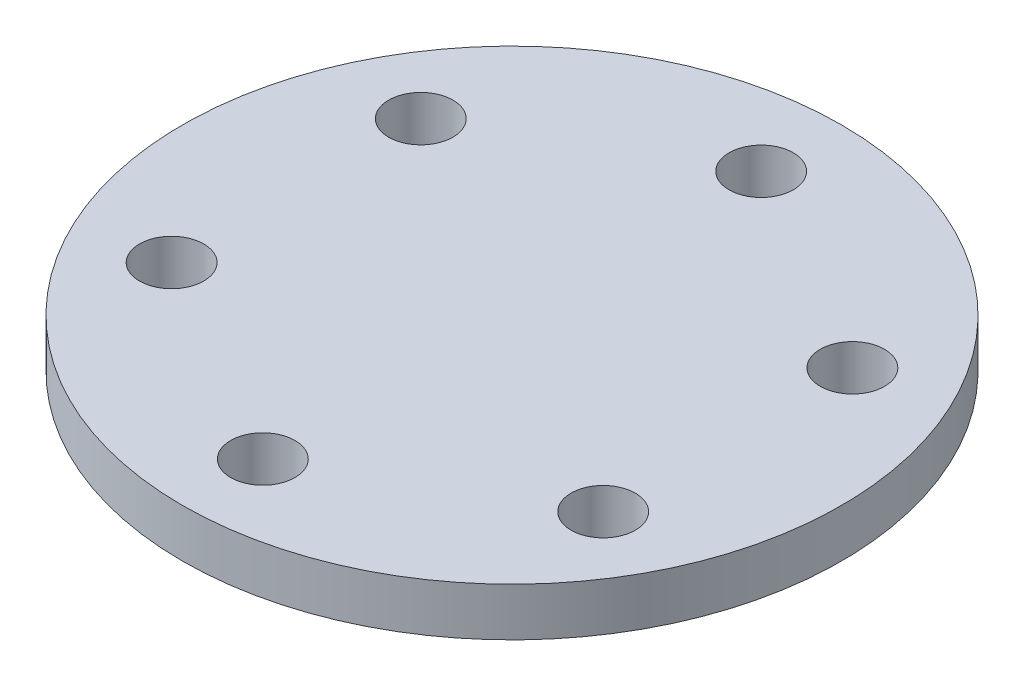
ISO-10303-21;
HEADER;
FILE_DESCRIPTION(('STEP AP214'),'2;1');
FILE_NAME('part.step','',(''),(''),'','','');
FILE_SCHEMA(('AUTOMOTIVE_DESIGN { 1 0 10303 214 1 1 1 1 }'));
ENDSEC;
DATA;
#1=APPLICATION_CONTEXT('core data for automotive mechanical design processes');
#2=APPLICATION_PROTOCOL_DEFINITION('international standard','automotive_design',2000,#1);
#3=PRODUCT_CONTEXT('',#1,'mechanical');
#4=PRODUCT('Part','Part','',(#3));
#5=PRODUCT_RELATED_PRODUCT_CATEGORY('part','',(#4));
#6=PRODUCT_DEFINITION_FORMATION('','',#4);
#7=PRODUCT_DEFINITION_CONTEXT('part definition',#1,'design');
#8=PRODUCT_DEFINITION('design','',#6,#7);
#9=PRODUCT_DEFINITION_SHAPE('','',#8);
#10=(LENGTH_UNIT() NAMED_UNIT(*) SI_UNIT(.MILLI.,.METRE.));
#11=(NAMED_UNIT(*) PLANE_ANGLE_UNIT() SI_UNIT($,.RADIAN.));
#12=(NAMED_UNIT(*) SI_UNIT($,.STERADIAN.) SOLID_ANGLE_UNIT());
#13=UNCERTAINTY_MEASURE_WITH_UNIT(LENGTH_MEASURE(1.E-05),#10,'distance_accuracy_value','');
#14=(GEOMETRIC_REPRESENTATION_CONTEXT(3) GLOBAL_UNCERTAINTY_ASSIGNED_CONTEXT((#13)) GLOBAL_UNIT_ASSIGNED_CONTEXT((#10,
#11,#12)) REPRESENTATION_CONTEXT('',''));
#15=CARTESIAN_POINT('',(0.,0.,0.));
#16=DIRECTION('',(0.,0.,1.));
#17=DIRECTION('',(1.,0.,0.));
#18=AXIS2_PLACEMENT_3D('',#15,#16,#17);
#19=CARTESIAN_POINT('',(0.,3.,0.));
#20=DIRECTION('',(0.,-1.,0.));
#21=DIRECTION('',(0.,0.,-1.));
#22=AXIS2_PLACEMENT_3D('',#19,#20,#21);
#23=CYLINDRICAL_SURFACE('',#22,20.5);
#24=CARTESIAN_POINT('',(0.,3.,0.));
#25=DIRECTION('',(0.,1.,0.));
#26=DIRECTION('',(0.,0.,1.));
#27=AXIS2_PLACEMENT_3D('',#24,#25,#26);
#28=CIRCLE('',#27,20.5);
#29=CARTESIAN_POINT('',(0.,3.,20.5));
#30=VERTEX_POINT('',#29);
#31=EDGE_CURVE('E10',#30,#30,#28,.T.);
#32=ORIENTED_EDGE('',*,*,#31,.F.);
#33=EDGE_LOOP('',(#32));
#34=FACE_BOUND('',#33,.T.);
#35=CARTESIAN_POINT('',(0.,0.,0.));
#36=DIRECTION('',(0.,1.,0.));
#37=DIRECTION('',(0.,0.,1.));
#38=AXIS2_PLACEMENT_3D('',#35,#36,#37);
#39=CIRCLE('',#38,20.5);
#40=CARTESIAN_POINT('',(0.,0.,20.5));
#41=VERTEX_POINT('',#40);
#42=EDGE_CURVE('E37',#41,#41,#39,.T.);
#43=ORIENTED_EDGE('',*,*,#42,.T.);
#44=EDGE_LOOP('',(#43));
#45=FACE_BOUND('',#44,.T.);
#46=ADVANCED_FACE('F34',(#34,#45),#23,.T.);
#47=CARTESIAN_POINT('',(0.,3.,0.));
#48=DIRECTION('',(0.,1.,0.));
#49=DIRECTION('',(0.,0.,1.));
#50=AXIS2_PLACEMENT_3D('',#47,#48,#49);
#51=PLANE('',#50);
#52=CARTESIAN_POINT('',(13.4233937586587,3.,-7.75000000000016));
#53=DIRECTION('',(0.,1.,0.));
#54=DIRECTION('',(-0.866025403784433,0.,0.50000000000001));
#55=AXIS2_PLACEMENT_3D('',#52,#53,#54);
#56=CIRCLE('',#55,2.);
#57=CARTESIAN_POINT('',(13.4233937586587,3.,-5.75000000000016));
#58=VERTEX_POINT('',#57);
#59=EDGE_CURVE('E62',#58,#58,#56,.T.);
#60=ORIENTED_EDGE('',*,*,#59,.F.);
#61=EDGE_LOOP('',(#60));
#62=FACE_BOUND('',#61,.T.);
#63=CARTESIAN_POINT('',(13.4233937586589,3.,7.74999999999987));
#64=DIRECTION('',(0.,1.,0.));
#65=DIRECTION('',(-0.866025403784443,0.,-0.499999999999992));
#66=AXIS2_PLACEMENT_3D('',#63,#64,#65);
#67=CIRCLE('',#66,2.);
#68=CARTESIAN_POINT('',(13.4233937586589,3.,9.74999999999988));
#69=VERTEX_POINT('',#68);
#70=EDGE_CURVE('E61',#69,#69,#67,.T.);
#71=ORIENTED_EDGE('',*,*,#70,.F.);
#72=EDGE_LOOP('',(#71));
#73=FACE_BOUND('',#72,.T.);
#74=CARTESIAN_POINT('',(0.,3.,15.5));
#75=DIRECTION('',(0.,1.,0.));
#76=DIRECTION('',(0.,0.,-1.));
#77=AXIS2_PLACEMENT_3D('',#74,#75,#76);
#78=CIRCLE('',#77,2.);
#79=CARTESIAN_POINT('',(0.,3.,17.5));
#80=VERTEX_POINT('',#79);
#81=EDGE_CURVE('E68',#80,#80,#78,.T.);
#82=ORIENTED_EDGE('',*,*,#81,.F.);
#83=EDGE_LOOP('',(#82));
#84=FACE_BOUND('',#83,.T.);
#85=CARTESIAN_POINT('',(-13.4233937586588,3.,7.75000000000006));
#86=DIRECTION('',(0.,1.,0.));
#87=DIRECTION('',(0.866025403784436,0.,-0.500000000000004));
#88=AXIS2_PLACEMENT_3D('',#85,#86,#87);
#89=CIRCLE('',#88,2.);
#90=CARTESIAN_POINT('',(-13.4233937586588,3.,9.75000000000006));
#91=VERTEX_POINT('',#90);
#92=EDGE_CURVE('E74',#91,#91,#89,.T.);
#93=ORIENTED_EDGE('',*,*,#92,.F.);
#94=EDGE_LOOP('',(#93));
#95=FACE_BOUND('',#94,.T.);
#96=CARTESIAN_POINT('',(-13.4233937586588,3.,-7.74999999999997));
#97=DIRECTION('',(0.,1.,0.));
#98=DIRECTION('',(0.86602540378444,0.,0.499999999999998));
#99=AXIS2_PLACEMENT_3D('',#96,#97,#98);
#100=CIRCLE('',#99,2.);
#101=CARTESIAN_POINT('',(-13.4233937586588,3.,-5.74999999999997));
#102=VERTEX_POINT('',#101);
#103=EDGE_CURVE('E54',#102,#102,#100,.T.);
#104=ORIENTED_EDGE('',*,*,#103,.F.);
#105=EDGE_LOOP('',(#104));
#106=FACE_BOUND('',#105,.T.);
#107=CARTESIAN_POINT('',(0.,3.,-15.5));
#108=DIRECTION('',(0.,1.,0.));
#109=DIRECTION('',(0.,0.,1.));
#110=AXIS2_PLACEMENT_3D('',#107,#108,#109);
#111=CIRCLE('',#110,2.);
#112=CARTESIAN_POINT('',(0.,3.,-13.5));
#113=VERTEX_POINT('',#112);
#114=EDGE_CURVE('E48',#113,#113,#111,.T.);
#115=ORIENTED_EDGE('',*,*,#114,.F.);
#116=EDGE_LOOP('',(#115));
#117=FACE_BOUND('',#116,.T.);
#118=ORIENTED_EDGE('',*,*,#31,.T.);
#119=EDGE_LOOP('',(#118));
#120=FACE_BOUND('',#119,.T.);
#121=ADVANCED_FACE('F85',(#62,#73,#84,#95,#106,#117,#120),#51,.T.);
#122=CARTESIAN_POINT('',(0.,0.,0.));
#123=DIRECTION('',(0.,1.,0.));
#124=DIRECTION('',(0.,0.,1.));
#125=AXIS2_PLACEMENT_3D('',#122,#123,#124);
#126=PLANE('',#125);
#127=CARTESIAN_POINT('',(13.4233937586587,0.,-7.75000000000016));
#128=DIRECTION('',(0.,1.,0.));
#129=DIRECTION('',(0.,0.,1.));
#130=AXIS2_PLACEMENT_3D('',#127,#128,#129);
#131=CIRCLE('',#130,2.);
#132=CARTESIAN_POINT('',(13.4233937586587,0.,-5.75000000000016));
#133=VERTEX_POINT('',#132);
#134=EDGE_CURVE('E58',#133,#133,#131,.F.);
#135=ORIENTED_EDGE('',*,*,#134,.F.);
#136=EDGE_LOOP('',(#135));
#137=FACE_BOUND('',#136,.T.);
#138=CARTESIAN_POINT('',(13.4233937586589,0.,7.74999999999987));
#139=DIRECTION('',(0.,1.,0.));
#140=DIRECTION('',(0.,0.,1.));
#141=AXIS2_PLACEMENT_3D('',#138,#139,#140);
#142=CIRCLE('',#141,2.);
#143=CARTESIAN_POINT('',(13.4233937586589,0.,9.74999999999988));
#144=VERTEX_POINT('',#143);
#145=EDGE_CURVE('E65',#144,#144,#142,.F.);
#146=ORIENTED_EDGE('',*,*,#145,.F.);
#147=EDGE_LOOP('',(#146));
#148=FACE_BOUND('',#147,.T.);
#149=CARTESIAN_POINT('',(0.,0.,15.5));
#150=DIRECTION('',(0.,1.,0.));
#151=DIRECTION('',(0.,0.,1.));
#152=AXIS2_PLACEMENT_3D('',#149,#150,#151);
#153=CIRCLE('',#152,2.);
#154=CARTESIAN_POINT('',(0.,0.,17.5));
#155=VERTEX_POINT('',#154);
#156=EDGE_CURVE('E71',#155,#155,#153,.F.);
#157=ORIENTED_EDGE('',*,*,#156,.F.);
#158=EDGE_LOOP('',(#157));
#159=FACE_BOUND('',#158,.T.);
#160=CARTESIAN_POINT('',(-13.4233937586588,0.,7.75000000000006));
#161=DIRECTION('',(0.,1.,0.));
#162=DIRECTION('',(0.,0.,1.));
#163=AXIS2_PLACEMENT_3D('',#160,#161,#162);
#164=CIRCLE('',#163,2.);
#165=CARTESIAN_POINT('',(-13.4233937586588,0.,9.75000000000006));
#166=VERTEX_POINT('',#165);
#167=EDGE_CURVE('E57',#166,#166,#164,.F.);
#168=ORIENTED_EDGE('',*,*,#167,.F.);
#169=EDGE_LOOP('',(#168));
#170=FACE_BOUND('',#169,.T.);
#171=CARTESIAN_POINT('',(-13.4233937586588,0.,-7.74999999999997));
#172=DIRECTION('',(0.,1.,0.));
#173=DIRECTION('',(0.,0.,1.));
#174=AXIS2_PLACEMENT_3D('',#171,#172,#173);
#175=CIRCLE('',#174,2.);
#176=CARTESIAN_POINT('',(-13.4233937586588,0.,-5.74999999999997));
#177=VERTEX_POINT('',#176);
#178=EDGE_CURVE('E51',#177,#177,#175,.F.);
#179=ORIENTED_EDGE('',*,*,#178,.F.);
#180=EDGE_LOOP('',(#179));
#181=FACE_BOUND('',#180,.T.);
#182=CARTESIAN_POINT('',(0.,0.,-15.5));
#183=DIRECTION('',(0.,1.,0.));
#184=DIRECTION('',(0.,0.,1.));
#185=AXIS2_PLACEMENT_3D('',#182,#183,#184);
#186=CIRCLE('',#185,2.);
#187=CARTESIAN_POINT('',(0.,0.,-13.5));
#188=VERTEX_POINT('',#187);
#189=EDGE_CURVE('E44',#188,#188,#186,.F.);
#190=ORIENTED_EDGE('',*,*,#189,.F.);
#191=EDGE_LOOP('',(#190));
#192=FACE_BOUND('',#191,.T.);
#193=ORIENTED_EDGE('',*,*,#42,.F.);
#194=EDGE_LOOP('',(#193));
#195=FACE_BOUND('',#194,.T.);
#196=ADVANCED_FACE('F88',(#137,#148,#159,#170,#181,#192,#195),#126,.F.);
#197=CARTESIAN_POINT('',(0.,-0.00100000000000013,-15.5));
#198=DIRECTION('',(0.,1.,0.));
#199=DIRECTION('',(0.,0.,1.));
#200=AXIS2_PLACEMENT_3D('',#197,#198,#199);
#201=CYLINDRICAL_SURFACE('',#200,2.);
#202=CARTESIAN_POINT('',(0.,3.,-13.5));
#203=CARTESIAN_POINT('',(0.,2.96875,-13.5));
#204=CARTESIAN_POINT('',(0.,2.9375,-13.5));
#205=CARTESIAN_POINT('',(0.,2.875,-13.5));
#206=CARTESIAN_POINT('',(0.,2.84375,-13.5));
#207=CARTESIAN_POINT('',(0.,2.78125,-13.5));
#208=CARTESIAN_POINT('',(0.,2.75,-13.5));
#209=CARTESIAN_POINT('',(0.,2.6875,-13.5));
#210=CARTESIAN_POINT('',(0.,2.65625,-13.5));
#211=CARTESIAN_POINT('',(0.,2.59375,-13.5));
#212=CARTESIAN_POINT('',(0.,2.5625,-13.5));
#213=CARTESIAN_POINT('',(0.,2.5,-13.5));
#214=CARTESIAN_POINT('',(0.,2.46875,-13.5));
#215=CARTESIAN_POINT('',(0.,2.40625,-13.5));
#216=CARTESIAN_POINT('',(0.,2.375,-13.5));
#217=CARTESIAN_POINT('',(0.,2.3125,-13.5));
#218=CARTESIAN_POINT('',(0.,2.28125,-13.5));
#219=CARTESIAN_POINT('',(0.,2.21875,-13.5));
#220=CARTESIAN_POINT('',(0.,2.1875,-13.5));
#221=CARTESIAN_POINT('',(0.,2.125,-13.5));
#222=CARTESIAN_POINT('',(0.,2.09375,-13.5));
#223=CARTESIAN_POINT('',(0.,2.03125,-13.5));
#224=CARTESIAN_POINT('',(0.,2.,-13.5));
#225=CARTESIAN_POINT('',(0.,1.9375,-13.5));
#226=CARTESIAN_POINT('',(0.,1.90625,-13.5));
#227=CARTESIAN_POINT('',(0.,1.84375,-13.5));
#228=CARTESIAN_POINT('',(0.,1.8125,-13.5));
#229=CARTESIAN_POINT('',(0.,1.75,-13.5));
#230=CARTESIAN_POINT('',(0.,1.71875,-13.5));
#231=CARTESIAN_POINT('',(0.,1.65625,-13.5));
#232=CARTESIAN_POINT('',(0.,1.625,-13.5));
#233=CARTESIAN_POINT('',(0.,1.5625,-13.5));
#234=CARTESIAN_POINT('',(0.,1.53125,-13.5));
#235=CARTESIAN_POINT('',(0.,1.46875,-13.5));
#236=CARTESIAN_POINT('',(0.,1.4375,-13.5));
#237=CARTESIAN_POINT('',(0.,1.375,-13.5));
#238=CARTESIAN_POINT('',(0.,1.34375,-13.5));
#239=CARTESIAN_POINT('',(0.,1.28125,-13.5));
#240=CARTESIAN_POINT('',(0.,1.25,-13.5));
#241=CARTESIAN_POINT('',(0.,1.1875,-13.5));
#242=CARTESIAN_POINT('',(0.,1.15625,-13.5));
#243=CARTESIAN_POINT('',(0.,1.09375,-13.5));
#244=CARTESIAN_POINT('',(0.,1.0625,-13.5));
#245=CARTESIAN_POINT('',(0.,1.,-13.5));
#246=CARTESIAN_POINT('',(0.,0.96875,-13.5));
#247=CARTESIAN_POINT('',(0.,0.90625,-13.5));
#248=CARTESIAN_POINT('',(0.,0.875,-13.5));
#249=CARTESIAN_POINT('',(0.,0.8125,-13.5));
#250=CARTESIAN_POINT('',(0.,0.78125,-13.5));
#251=CARTESIAN_POINT('',(0.,0.71875,-13.5));
#252=CARTESIAN_POINT('',(0.,0.6875,-13.5));
#253=CARTESIAN_POINT('',(0.,0.625,-13.5));
#254=CARTESIAN_POINT('',(0.,0.59375,-13.5));
#255=CARTESIAN_POINT('',(0.,0.53125,-13.5));
#256=CARTESIAN_POINT('',(0.,0.5,-13.5));
#257=CARTESIAN_POINT('',(0.,0.4375,-13.5));
#258=CARTESIAN_POINT('',(0.,0.40625,-13.5));
#259=CARTESIAN_POINT('',(0.,0.34375,-13.5));
#260=CARTESIAN_POINT('',(0.,0.3125,-13.5));
#261=CARTESIAN_POINT('',(0.,0.25,-13.5));
#262=CARTESIAN_POINT('',(0.,0.21875,-13.5));
#263=CARTESIAN_POINT('',(0.,0.15625,-13.5));
#264=CARTESIAN_POINT('',(0.,0.125,-13.5));
#265=CARTESIAN_POINT('',(0.,0.0625000000000001,-13.5));
#266=CARTESIAN_POINT('',(0.,0.0312500000000001,-13.5));
#267=CARTESIAN_POINT('',(0.,0.,-13.5));
#268=B_SPLINE_CURVE_WITH_KNOTS('',3,(#202,#203,#204,#205,#206,#207,#208,#209,#210,#211,#212,
#213,#214,#215,#216,#217,#218,#219,#220,#221,#222,#223,#224,#225,#226,#227,#228,#229,#230,#231,
#232,#233,#234,#235,#236,#237,#238,#239,#240,#241,#242,#243,#244,#245,#246,#247,#248,#249,#250,
#251,#252,#253,#254,#255,#256,#257,#258,#259,#260,#261,#262,#263,#264,#265,#266,#267),
.UNSPECIFIED.,.F.,.F.,(4,2,2,2,2,2,2,2,2,2,2,2,2,2,2,2,2,2,2,2,2,2,2,2,2,2,2,2,2,2,2,2,4),(0.,
0.0937500000000001,0.1875,0.28125,0.375,0.46875,0.5625,0.65625,0.75,0.84375,0.9375,1.03125,
1.125,1.21875,1.3125,1.40625,1.5,1.59375,1.6875,1.78125,1.875,1.96875,2.0625,2.15625,2.25,
2.34375,2.4375,2.53125,2.625,2.71875,2.8125,2.90625,3.),.UNSPECIFIED.);
#269=EDGE_CURVE('BSEAM95',#113,#188,#268,.T.);
#270=ORIENTED_EDGE('',*,*,#114,.T.);
#271=ORIENTED_EDGE('',*,*,#189,.T.);
#272=ORIENTED_EDGE('',*,*,#269,.T.);
#273=ORIENTED_EDGE('',*,*,#269,.F.);
#274=EDGE_LOOP('',(#270,#272,#271,#273));
#275=FACE_BOUND('',#274,.T.);
#276=ADVANCED_FACE('F95',(#275),#201,.F.);
#277=CARTESIAN_POINT('',(-13.4233937586588,-0.00100000000000013,-7.74999999999997));
#278=DIRECTION('',(0.,1.,0.));
#279=DIRECTION('',(0.,0.,1.));
#280=AXIS2_PLACEMENT_3D('',#277,#278,#279);
#281=CYLINDRICAL_SURFACE('',#280,2.);
#282=CARTESIAN_POINT('',(-13.4233937586588,3.,-5.74999999999997));
#283=CARTESIAN_POINT('',(-13.4233937586588,2.96875,-5.74999999999997));
#284=CARTESIAN_POINT('',(-13.4233937586588,2.9375,-5.74999999999997));
#285=CARTESIAN_POINT('',(-13.4233937586588,2.875,-5.74999999999997));
#286=CARTESIAN_POINT('',(-13.4233937586588,2.84375,-5.74999999999997));
#287=CARTESIAN_POINT('',(-13.4233937586588,2.78125,-5.74999999999997));
#288=CARTESIAN_POINT('',(-13.4233937586588,2.75,-5.74999999999997));
#289=CARTESIAN_POINT('',(-13.4233937586588,2.6875,-5.74999999999997));
#290=CARTESIAN_POINT('',(-13.4233937586588,2.65625,-5.74999999999997));
#291=CARTESIAN_POINT('',(-13.4233937586588,2.59375,-5.74999999999997));
#292=CARTESIAN_POINT('',(-13.4233937586588,2.5625,-5.74999999999997));
#293=CARTESIAN_POINT('',(-13.4233937586588,2.5,-5.74999999999997));
#294=CARTESIAN_POINT('',(-13.4233937586588,2.46875,-5.74999999999997));
#295=CARTESIAN_POINT('',(-13.4233937586588,2.40625,-5.74999999999997));
#296=CARTESIAN_POINT('',(-13.4233937586588,2.375,-5.74999999999997));
#297=CARTESIAN_POINT('',(-13.4233937586588,2.3125,-5.74999999999997));
#298=CARTESIAN_POINT('',(-13.4233937586588,2.28125,-5.74999999999997));
#299=CARTESIAN_POINT('',(-13.4233937586588,2.21875,-5.74999999999997));
#300=CARTESIAN_POINT('',(-13.4233937586588,2.1875,-5.74999999999997));
#301=CARTESIAN_POINT('',(-13.4233937586588,2.125,-5.74999999999997));
#302=CARTESIAN_POINT('',(-13.4233937586588,2.09375,-5.74999999999997));
#303=CARTESIAN_POINT('',(-13.4233937586588,2.03125,-5.74999999999997));
#304=CARTESIAN_POINT('',(-13.4233937586588,2.,-5.74999999999997));
#305=CARTESIAN_POINT('',(-13.4233937586588,1.9375,-5.74999999999997));
#306=CARTESIAN_POINT('',(-13.4233937586588,1.90625,-5.74999999999997));
#307=CARTESIAN_POINT('',(-13.4233937586588,1.84375,-5.74999999999997));
#308=CARTESIAN_POINT('',(-13.4233937586588,1.8125,-5.74999999999997));
#309=CARTESIAN_POINT('',(-13.4233937586588,1.75,-5.74999999999997));
#310=CARTESIAN_POINT('',(-13.4233937586588,1.71875,-5.74999999999997));
#311=CARTESIAN_POINT('',(-13.4233937586588,1.65625,-5.74999999999997));
#312=CARTESIAN_POINT('',(-13.4233937586588,1.625,-5.74999999999997));
#313=CARTESIAN_POINT('',(-13.4233937586588,1.5625,-5.74999999999997));
#314=CARTESIAN_POINT('',(-13.4233937586588,1.53125,-5.74999999999997));
#315=CARTESIAN_POINT('',(-13.4233937586588,1.46875,-5.74999999999997));
#316=CARTESIAN_POINT('',(-13.4233937586588,1.4375,-5.74999999999997));
#317=CARTESIAN_POINT('',(-13.4233937586588,1.375,-5.74999999999997));
#318=CARTESIAN_POINT('',(-13.4233937586588,1.34375,-5.74999999999997));
#319=CARTESIAN_POINT('',(-13.4233937586588,1.28125,-5.74999999999997));
#320=CARTESIAN_POINT('',(-13.4233937586588,1.25,-5.74999999999997));
#321=CARTESIAN_POINT('',(-13.4233937586588,1.1875,-5.74999999999997));
#322=CARTESIAN_POINT('',(-13.4233937586588,1.15625,-5.74999999999997));
#323=CARTESIAN_POINT('',(-13.4233937586588,1.09375,-5.74999999999997));
#324=CARTESIAN_POINT('',(-13.4233937586588,1.0625,-5.74999999999997));
#325=CARTESIAN_POINT('',(-13.4233937586588,1.,-5.74999999999997));
#326=CARTESIAN_POINT('',(-13.4233937586588,0.96875,-5.74999999999997));
#327=CARTESIAN_POINT('',(-13.4233937586588,0.90625,-5.74999999999997));
#328=CARTESIAN_POINT('',(-13.4233937586588,0.875,-5.74999999999997));
#329=CARTESIAN_POINT('',(-13.4233937586588,0.8125,-5.74999999999997));
#330=CARTESIAN_POINT('',(-13.4233937586588,0.78125,-5.74999999999997));
#331=CARTESIAN_POINT('',(-13.4233937586588,0.71875,-5.74999999999997));
#332=CARTESIAN_POINT('',(-13.4233937586588,0.6875,-5.74999999999997));
#333=CARTESIAN_POINT('',(-13.4233937586588,0.625,-5.74999999999997));
#334=CARTESIAN_POINT('',(-13.4233937586588,0.59375,-5.74999999999997));
#335=CARTESIAN_POINT('',(-13.4233937586588,0.53125,-5.74999999999997));
#336=CARTESIAN_POINT('',(-13.4233937586588,0.5,-5.74999999999997));
#337=CARTESIAN_POINT('',(-13.4233937586588,0.4375,-5.74999999999997));
#338=CARTESIAN_POINT('',(-13.4233937586588,0.40625,-5.74999999999997));
#339=CARTESIAN_POINT('',(-13.4233937586588,0.34375,-5.74999999999997));
#340=CARTESIAN_POINT('',(-13.4233937586588,0.3125,-5.74999999999997));
#341=CARTESIAN_POINT('',(-13.4233937586588,0.25,-5.74999999999997));
#342=CARTESIAN_POINT('',(-13.4233937586588,0.21875,-5.74999999999997));
#343=CARTESIAN_POINT('',(-13.4233937586588,0.15625,-5.74999999999997));
#344=CARTESIAN_POINT('',(-13.4233937586588,0.125,-5.74999999999997));
#345=CARTESIAN_POINT('',(-13.4233937586588,0.0625000000000001,-5.74999999999997));
#346=CARTESIAN_POINT('',(-13.4233937586588,0.0312500000000001,-5.74999999999997));
#347=CARTESIAN_POINT('',(-13.4233937586588,0.,-5.74999999999997));
#348=B_SPLINE_CURVE_WITH_KNOTS('',3,(#282,#283,#284,#285,#286,#287,#288,#289,#290,#291,#292,
#293,#294,#295,#296,#297,#298,#299,#300,#301,#302,#303,#304,#305,#306,#307,#308,#309,#310,#311,
#312,#313,#314,#315,#316,#317,#318,#319,#320,#321,#322,#323,#324,#325,#326,#327,#328,#329,#330,
#331,#332,#333,#334,#335,#336,#337,#338,#339,#340,#341,#342,#343,#344,#345,#346,#347),
.UNSPECIFIED.,.F.,.F.,(4,2,2,2,2,2,2,2,2,2,2,2,2,2,2,2,2,2,2,2,2,2,2,2,2,2,2,2,2,2,2,2,4),(0.,
0.0937500000000001,0.1875,0.28125,0.375,0.46875,0.5625,0.65625,0.75,0.84375,0.9375,1.03125,
1.125,1.21875,1.3125,1.40625,1.5,1.59375,1.6875,1.78125,1.875,1.96875,2.0625,2.15625,2.25,
2.34375,2.4375,2.53125,2.625,2.71875,2.8125,2.90625,3.),.UNSPECIFIED.);
#349=EDGE_CURVE('BSEAM98',#102,#177,#348,.T.);
#350=ORIENTED_EDGE('',*,*,#103,.T.);
#351=ORIENTED_EDGE('',*,*,#178,.T.);
#352=ORIENTED_EDGE('',*,*,#349,.T.);
#353=ORIENTED_EDGE('',*,*,#349,.F.);
#354=EDGE_LOOP('',(#350,#352,#351,#353));
#355=FACE_BOUND('',#354,.T.);
#356=ADVANCED_FACE('F98',(#355),#281,.F.);
#357=CARTESIAN_POINT('',(-13.4233937586588,-0.00100000000000013,7.75000000000006));
#358=DIRECTION('',(0.,1.,0.));
#359=DIRECTION('',(0.,0.,1.));
#360=AXIS2_PLACEMENT_3D('',#357,#358,#359);
#361=CYLINDRICAL_SURFACE('',#360,2.);
#362=CARTESIAN_POINT('',(-13.4233937586588,3.,9.75000000000006));
#363=CARTESIAN_POINT('',(-13.4233937586588,2.96875,9.75000000000006));
#364=CARTESIAN_POINT('',(-13.4233937586588,2.9375,9.75000000000006));
#365=CARTESIAN_POINT('',(-13.4233937586588,2.875,9.75000000000006));
#366=CARTESIAN_POINT('',(-13.4233937586588,2.84375,9.75000000000006));
#367=CARTESIAN_POINT('',(-13.4233937586588,2.78125,9.75000000000006));
#368=CARTESIAN_POINT('',(-13.4233937586588,2.75,9.75000000000006));
#369=CARTESIAN_POINT('',(-13.4233937586588,2.6875,9.75000000000006));
#370=CARTESIAN_POINT('',(-13.4233937586588,2.65625,9.75000000000006));
#371=CARTESIAN_POINT('',(-13.4233937586588,2.59375,9.75000000000006));
#372=CARTESIAN_POINT('',(-13.4233937586588,2.5625,9.75000000000006));
#373=CARTESIAN_POINT('',(-13.4233937586588,2.5,9.75000000000006));
#374=CARTESIAN_POINT('',(-13.4233937586588,2.46875,9.75000000000006));
#375=CARTESIAN_POINT('',(-13.4233937586588,2.40625,9.75000000000006));
#376=CARTESIAN_POINT('',(-13.4233937586588,2.375,9.75000000000006));
#377=CARTESIAN_POINT('',(-13.4233937586588,2.3125,9.75000000000006));
#378=CARTESIAN_POINT('',(-13.4233937586588,2.28125,9.75000000000006));
#379=CARTESIAN_POINT('',(-13.4233937586588,2.21875,9.75000000000006));
#380=CARTESIAN_POINT('',(-13.4233937586588,2.1875,9.75000000000006));
#381=CARTESIAN_POINT('',(-13.4233937586588,2.125,9.75000000000006));
#382=CARTESIAN_POINT('',(-13.4233937586588,2.09375,9.75000000000006));
#383=CARTESIAN_POINT('',(-13.4233937586588,2.03125,9.75000000000006));
#384=CARTESIAN_POINT('',(-13.4233937586588,2.,9.75000000000006));
#385=CARTESIAN_POINT('',(-13.4233937586588,1.9375,9.75000000000006));
#386=CARTESIAN_POINT('',(-13.4233937586588,1.90625,9.75000000000006));
#387=CARTESIAN_POINT('',(-13.4233937586588,1.84375,9.75000000000006));
#388=CARTESIAN_POINT('',(-13.4233937586588,1.8125,9.75000000000006));
#389=CARTESIAN_POINT('',(-13.4233937586588,1.75,9.75000000000006));
#390=CARTESIAN_POINT('',(-13.4233937586588,1.71875,9.75000000000006));
#391=CARTESIAN_POINT('',(-13.4233937586588,1.65625,9.75000000000006));
#392=CARTESIAN_POINT('',(-13.4233937586588,1.625,9.75000000000006));
#393=CARTESIAN_POINT('',(-13.4233937586588,1.5625,9.75000000000006));
#394=CARTESIAN_POINT('',(-13.4233937586588,1.53125,9.75000000000006));
#395=CARTESIAN_POINT('',(-13.4233937586588,1.46875,9.75000000000006));
#396=CARTESIAN_POINT('',(-13.4233937586588,1.4375,9.75000000000006));
#397=CARTESIAN_POINT('',(-13.4233937586588,1.375,9.75000000000006));
#398=CARTESIAN_POINT('',(-13.4233937586588,1.34375,9.75000000000006));
#399=CARTESIAN_POINT('',(-13.4233937586588,1.28125,9.75000000000006));
#400=CARTESIAN_POINT('',(-13.4233937586588,1.25,9.75000000000006));
#401=CARTESIAN_POINT('',(-13.4233937586588,1.1875,9.75000000000006));
#402=CARTESIAN_POINT('',(-13.4233937586588,1.15625,9.75000000000006));
#403=CARTESIAN_POINT('',(-13.4233937586588,1.09375,9.75000000000006));
#404=CARTESIAN_POINT('',(-13.4233937586588,1.0625,9.75000000000006));
#405=CARTESIAN_POINT('',(-13.4233937586588,1.,9.75000000000006));
#406=CARTESIAN_POINT('',(-13.4233937586588,0.96875,9.75000000000006));
#407=CARTESIAN_POINT('',(-13.4233937586588,0.90625,9.75000000000006));
#408=CARTESIAN_POINT('',(-13.4233937586588,0.875,9.75000000000006));
#409=CARTESIAN_POINT('',(-13.4233937586588,0.8125,9.75000000000006));
#410=CARTESIAN_POINT('',(-13.4233937586588,0.78125,9.75000000000006));
#411=CARTESIAN_POINT('',(-13.4233937586588,0.71875,9.75000000000006));
#412=CARTESIAN_POINT('',(-13.4233937586588,0.6875,9.75000000000006));
#413=CARTESIAN_POINT('',(-13.4233937586588,0.625,9.75000000000006));
#414=CARTESIAN_POINT('',(-13.4233937586588,0.59375,9.75000000000006));
#415=CARTESIAN_POINT('',(-13.4233937586588,0.53125,9.75000000000006));
#416=CARTESIAN_POINT('',(-13.4233937586588,0.5,9.75000000000006));
#417=CARTESIAN_POINT('',(-13.4233937586588,0.4375,9.75000000000006));
#418=CARTESIAN_POINT('',(-13.4233937586588,0.40625,9.75000000000006));
#419=CARTESIAN_POINT('',(-13.4233937586588,0.34375,9.75000000000006));
#420=CARTESIAN_POINT('',(-13.4233937586588,0.3125,9.75000000000006));
#421=CARTESIAN_POINT('',(-13.4233937586588,0.25,9.75000000000006));
#422=CARTESIAN_POINT('',(-13.4233937586588,0.21875,9.75000000000006));
#423=CARTESIAN_POINT('',(-13.4233937586588,0.15625,9.75000000000006));
#424=CARTESIAN_POINT('',(-13.4233937586588,0.125,9.75000000000006));
#425=CARTESIAN_POINT('',(-13.4233937586588,0.0625000000000001,9.75000000000006));
#426=CARTESIAN_POINT('',(-13.4233937586588,0.0312500000000001,9.75000000000006));
#427=CARTESIAN_POINT('',(-13.4233937586588,0.,9.75000000000006));
#428=B_SPLINE_CURVE_WITH_KNOTS('',3,(#362,#363,#364,#365,#366,#367,#368,#369,#370,#371,#372,
#373,#374,#375,#376,#377,#378,#379,#380,#381,#382,#383,#384,#385,#386,#387,#388,#389,#390,#391,
#392,#393,#394,#395,#396,#397,#398,#399,#400,#401,#402,#403,#404,#405,#406,#407,#408,#409,#410,
#411,#412,#413,#414,#415,#416,#417,#418,#419,#420,#421,#422,#423,#424,#425,#426,#427),
.UNSPECIFIED.,.F.,.F.,(4,2,2,2,2,2,2,2,2,2,2,2,2,2,2,2,2,2,2,2,2,2,2,2,2,2,2,2,2,2,2,2,4),(0.,
0.0937500000000001,0.1875,0.28125,0.375,0.46875,0.5625,0.65625,0.75,0.84375,0.9375,1.03125,
1.125,1.21875,1.3125,1.40625,1.5,1.59375,1.6875,1.78125,1.875,1.96875,2.0625,2.15625,2.25,
2.34375,2.4375,2.53125,2.625,2.71875,2.8125,2.90625,3.),.UNSPECIFIED.);
#429=EDGE_CURVE('BSEAM82',#91,#166,#428,.T.);
#430=ORIENTED_EDGE('',*,*,#92,.T.);
#431=ORIENTED_EDGE('',*,*,#167,.T.);
#432=ORIENTED_EDGE('',*,*,#429,.T.);
#433=ORIENTED_EDGE('',*,*,#429,.F.);
#434=EDGE_LOOP('',(#430,#432,#431,#433));
#435=FACE_BOUND('',#434,.T.);
#436=ADVANCED_FACE('F82',(#435),#361,.F.);
#437=CARTESIAN_POINT('',(0.,-0.00100000000000013,15.5));
#438=DIRECTION('',(0.,1.,0.));
#439=DIRECTION('',(0.,0.,1.));
#440=AXIS2_PLACEMENT_3D('',#437,#438,#439);
#441=CYLINDRICAL_SURFACE('',#440,2.);
#442=CARTESIAN_POINT('',(0.,3.,17.5));
#443=CARTESIAN_POINT('',(0.,2.96875,17.5));
#444=CARTESIAN_POINT('',(0.,2.9375,17.5));
#445=CARTESIAN_POINT('',(0.,2.875,17.5));
#446=CARTESIAN_POINT('',(0.,2.84375,17.5));
#447=CARTESIAN_POINT('',(0.,2.78125,17.5));
#448=CARTESIAN_POINT('',(0.,2.75,17.5));
#449=CARTESIAN_POINT('',(0.,2.6875,17.5));
#450=CARTESIAN_POINT('',(0.,2.65625,17.5));
#451=CARTESIAN_POINT('',(0.,2.59375,17.5));
#452=CARTESIAN_POINT('',(0.,2.5625,17.5));
#453=CARTESIAN_POINT('',(0.,2.5,17.5));
#454=CARTESIAN_POINT('',(0.,2.46875,17.5));
#455=CARTESIAN_POINT('',(0.,2.40625,17.5));
#456=CARTESIAN_POINT('',(0.,2.375,17.5));
#457=CARTESIAN_POINT('',(0.,2.3125,17.5));
#458=CARTESIAN_POINT('',(0.,2.28125,17.5));
#459=CARTESIAN_POINT('',(0.,2.21875,17.5));
#460=CARTESIAN_POINT('',(0.,2.1875,17.5));
#461=CARTESIAN_POINT('',(0.,2.125,17.5));
#462=CARTESIAN_POINT('',(0.,2.09375,17.5));
#463=CARTESIAN_POINT('',(0.,2.03125,17.5));
#464=CARTESIAN_POINT('',(0.,2.,17.5));
#465=CARTESIAN_POINT('',(0.,1.9375,17.5));
#466=CARTESIAN_POINT('',(0.,1.90625,17.5));
#467=CARTESIAN_POINT('',(0.,1.84375,17.5));
#468=CARTESIAN_POINT('',(0.,1.8125,17.5));
#469=CARTESIAN_POINT('',(0.,1.75,17.5));
#470=CARTESIAN_POINT('',(0.,1.71875,17.5));
#471=CARTESIAN_POINT('',(0.,1.65625,17.5));
#472=CARTESIAN_POINT('',(0.,1.625,17.5));
#473=CARTESIAN_POINT('',(0.,1.5625,17.5));
#474=CARTESIAN_POINT('',(0.,1.53125,17.5));
#475=CARTESIAN_POINT('',(0.,1.46875,17.5));
#476=CARTESIAN_POINT('',(0.,1.4375,17.5));
#477=CARTESIAN_POINT('',(0.,1.375,17.5));
#478=CARTESIAN_POINT('',(0.,1.34375,17.5));
#479=CARTESIAN_POINT('',(0.,1.28125,17.5));
#480=CARTESIAN_POINT('',(0.,1.25,17.5));
#481=CARTESIAN_POINT('',(0.,1.1875,17.5));
#482=CARTESIAN_POINT('',(0.,1.15625,17.5));
#483=CARTESIAN_POINT('',(0.,1.09375,17.5));
#484=CARTESIAN_POINT('',(0.,1.0625,17.5));
#485=CARTESIAN_POINT('',(0.,1.,17.5));
#486=CARTESIAN_POINT('',(0.,0.96875,17.5));
#487=CARTESIAN_POINT('',(0.,0.90625,17.5));
#488=CARTESIAN_POINT('',(0.,0.875,17.5));
#489=CARTESIAN_POINT('',(0.,0.8125,17.5));
#490=CARTESIAN_POINT('',(0.,0.78125,17.5));
#491=CARTESIAN_POINT('',(0.,0.71875,17.5));
#492=CARTESIAN_POINT('',(0.,0.6875,17.5));
#493=CARTESIAN_POINT('',(0.,0.625,17.5));
#494=CARTESIAN_POINT('',(0.,0.59375,17.5));
#495=CARTESIAN_POINT('',(0.,0.53125,17.5));
#496=CARTESIAN_POINT('',(0.,0.5,17.5));
#497=CARTESIAN_POINT('',(0.,0.4375,17.5));
#498=CARTESIAN_POINT('',(0.,0.40625,17.5));
#499=CARTESIAN_POINT('',(0.,0.34375,17.5));
#500=CARTESIAN_POINT('',(0.,0.3125,17.5));
#501=CARTESIAN_POINT('',(0.,0.25,17.5));
#502=CARTESIAN_POINT('',(0.,0.21875,17.5));
#503=CARTESIAN_POINT('',(0.,0.15625,17.5));
#504=CARTESIAN_POINT('',(0.,0.125,17.5));
#505=CARTESIAN_POINT('',(0.,0.0625000000000001,17.5));
#506=CARTESIAN_POINT('',(0.,0.0312500000000001,17.5));
#507=CARTESIAN_POINT('',(0.,0.,17.5));
#508=B_SPLINE_CURVE_WITH_KNOTS('',3,(#442,#443,#444,#445,#446,#447,#448,#449,#450,#451,#452,
#453,#454,#455,#456,#457,#458,#459,#460,#461,#462,#463,#464,#465,#466,#467,#468,#469,#470,#471,
#472,#473,#474,#475,#476,#477,#478,#479,#480,#481,#482,#483,#484,#485,#486,#487,#488,#489,#490,
#491,#492,#493,#494,#495,#496,#497,#498,#499,#500,#501,#502,#503,#504,#505,#506,#507),
.UNSPECIFIED.,.F.,.F.,(4,2,2,2,2,2,2,2,2,2,2,2,2,2,2,2,2,2,2,2,2,2,2,2,2,2,2,2,2,2,2,2,4),(0.,
0.0937500000000001,0.1875,0.28125,0.375,0.46875,0.5625,0.65625,0.75,0.84375,0.9375,1.03125,
1.125,1.21875,1.3125,1.40625,1.5,1.59375,1.6875,1.78125,1.875,1.96875,2.0625,2.15625,2.25,
2.34375,2.4375,2.53125,2.625,2.71875,2.8125,2.90625,3.),.UNSPECIFIED.);
#509=EDGE_CURVE('BSEAM136',#80,#155,#508,.T.);
#510=ORIENTED_EDGE('',*,*,#81,.T.);
#511=ORIENTED_EDGE('',*,*,#156,.T.);
#512=ORIENTED_EDGE('',*,*,#509,.T.);
#513=ORIENTED_EDGE('',*,*,#509,.F.);
#514=EDGE_LOOP('',(#510,#512,#511,#513));
#515=FACE_BOUND('',#514,.T.);
#516=ADVANCED_FACE('F136',(#515),#441,.F.);
#517=CARTESIAN_POINT('',(13.4233937586589,-0.00100000000000013,7.74999999999987));
#518=DIRECTION('',(0.,1.,0.));
#519=DIRECTION('',(0.,0.,1.));
#520=AXIS2_PLACEMENT_3D('',#517,#518,#519);
#521=CYLINDRICAL_SURFACE('',#520,2.);
#522=CARTESIAN_POINT('',(13.4233937586589,3.,9.74999999999988));
#523=CARTESIAN_POINT('',(13.4233937586589,2.96875,9.74999999999988));
#524=CARTESIAN_POINT('',(13.4233937586589,2.9375,9.74999999999988));
#525=CARTESIAN_POINT('',(13.4233937586589,2.875,9.74999999999988));
#526=CARTESIAN_POINT('',(13.4233937586589,2.84375,9.74999999999988));
#527=CARTESIAN_POINT('',(13.4233937586589,2.78125,9.74999999999988));
#528=CARTESIAN_POINT('',(13.4233937586589,2.75,9.74999999999988));
#529=CARTESIAN_POINT('',(13.4233937586589,2.6875,9.74999999999988));
#530=CARTESIAN_POINT('',(13.4233937586589,2.65625,9.74999999999988));
#531=CARTESIAN_POINT('',(13.4233937586589,2.59375,9.74999999999988));
#532=CARTESIAN_POINT('',(13.4233937586589,2.5625,9.74999999999988));
#533=CARTESIAN_POINT('',(13.4233937586589,2.5,9.74999999999988));
#534=CARTESIAN_POINT('',(13.4233937586589,2.46875,9.74999999999988));
#535=CARTESIAN_POINT('',(13.4233937586589,2.40625,9.74999999999988));
#536=CARTESIAN_POINT('',(13.4233937586589,2.375,9.74999999999988));
#537=CARTESIAN_POINT('',(13.4233937586589,2.3125,9.74999999999988));
#538=CARTESIAN_POINT('',(13.4233937586589,2.28125,9.74999999999988));
#539=CARTESIAN_POINT('',(13.4233937586589,2.21875,9.74999999999988));
#540=CARTESIAN_POINT('',(13.4233937586589,2.1875,9.74999999999988));
#541=CARTESIAN_POINT('',(13.4233937586589,2.125,9.74999999999988));
#542=CARTESIAN_POINT('',(13.4233937586589,2.09375,9.74999999999988));
#543=CARTESIAN_POINT('',(13.4233937586589,2.03125,9.74999999999988));
#544=CARTESIAN_POINT('',(13.4233937586589,2.,9.74999999999988));
#545=CARTESIAN_POINT('',(13.4233937586589,1.9375,9.74999999999988));
#546=CARTESIAN_POINT('',(13.4233937586589,1.90625,9.74999999999988));
#547=CARTESIAN_POINT('',(13.4233937586589,1.84375,9.74999999999988));
#548=CARTESIAN_POINT('',(13.4233937586589,1.8125,9.74999999999988));
#549=CARTESIAN_POINT('',(13.4233937586589,1.75,9.74999999999988));
#550=CARTESIAN_POINT('',(13.4233937586589,1.71875,9.74999999999988));
#551=CARTESIAN_POINT('',(13.4233937586589,1.65625,9.74999999999988));
#552=CARTESIAN_POINT('',(13.4233937586589,1.625,9.74999999999988));
#553=CARTESIAN_POINT('',(13.4233937586589,1.5625,9.74999999999988));
#554=CARTESIAN_POINT('',(13.4233937586589,1.53125,9.74999999999988));
#555=CARTESIAN_POINT('',(13.4233937586589,1.46875,9.74999999999988));
#556=CARTESIAN_POINT('',(13.4233937586589,1.4375,9.74999999999988));
#557=CARTESIAN_POINT('',(13.4233937586589,1.375,9.74999999999988));
#558=CARTESIAN_POINT('',(13.4233937586589,1.34375,9.74999999999988));
#559=CARTESIAN_POINT('',(13.4233937586589,1.28125,9.74999999999988));
#560=CARTESIAN_POINT('',(13.4233937586589,1.25,9.74999999999988));
#561=CARTESIAN_POINT('',(13.4233937586589,1.1875,9.74999999999988));
#562=CARTESIAN_POINT('',(13.4233937586589,1.15625,9.74999999999988));
#563=CARTESIAN_POINT('',(13.4233937586589,1.09375,9.74999999999988));
#564=CARTESIAN_POINT('',(13.4233937586589,1.0625,9.74999999999988));
#565=CARTESIAN_POINT('',(13.4233937586589,1.,9.74999999999988));
#566=CARTESIAN_POINT('',(13.4233937586589,0.96875,9.74999999999988));
#567=CARTESIAN_POINT('',(13.4233937586589,0.90625,9.74999999999988));
#568=CARTESIAN_POINT('',(13.4233937586589,0.875,9.74999999999988));
#569=CARTESIAN_POINT('',(13.4233937586589,0.8125,9.74999999999988));
#570=CARTESIAN_POINT('',(13.4233937586589,0.78125,9.74999999999988));
#571=CARTESIAN_POINT('',(13.4233937586589,0.71875,9.74999999999988));
#572=CARTESIAN_POINT('',(13.4233937586589,0.6875,9.74999999999988));
#573=CARTESIAN_POINT('',(13.4233937586589,0.625,9.74999999999988));
#574=CARTESIAN_POINT('',(13.4233937586589,0.59375,9.74999999999988));
#575=CARTESIAN_POINT('',(13.4233937586589,0.53125,9.74999999999988));
#576=CARTESIAN_POINT('',(13.4233937586589,0.5,9.74999999999988));
#577=CARTESIAN_POINT('',(13.4233937586589,0.4375,9.74999999999988));
#578=CARTESIAN_POINT('',(13.4233937586589,0.40625,9.74999999999988));
#579=CARTESIAN_POINT('',(13.4233937586589,0.34375,9.74999999999988));
#580=CARTESIAN_POINT('',(13.4233937586589,0.3125,9.74999999999988));
#581=CARTESIAN_POINT('',(13.4233937586589,0.25,9.74999999999988));
#582=CARTESIAN_POINT('',(13.4233937586589,0.21875,9.74999999999988));
#583=CARTESIAN_POINT('',(13.4233937586589,0.15625,9.74999999999988));
#584=CARTESIAN_POINT('',(13.4233937586589,0.125,9.74999999999988));
#585=CARTESIAN_POINT('',(13.4233937586589,0.0625000000000001,9.74999999999988));
#586=CARTESIAN_POINT('',(13.4233937586589,0.0312500000000001,9.74999999999988));
#587=CARTESIAN_POINT('',(13.4233937586589,0.,9.74999999999988));
#588=B_SPLINE_CURVE_WITH_KNOTS('',3,(#522,#523,#524,#525,#526,#527,#528,#529,#530,#531,#532,
#533,#534,#535,#536,#537,#538,#539,#540,#541,#542,#543,#544,#545,#546,#547,#548,#549,#550,#551,
#552,#553,#554,#555,#556,#557,#558,#559,#560,#561,#562,#563,#564,#565,#566,#567,#568,#569,#570,
#571,#572,#573,#574,#575,#576,#577,#578,#579,#580,#581,#582,#583,#584,#585,#586,#587),
.UNSPECIFIED.,.F.,.F.,(4,2,2,2,2,2,2,2,2,2,2,2,2,2,2,2,2,2,2,2,2,2,2,2,2,2,2,2,2,2,2,2,4),(0.,
0.0937500000000001,0.1875,0.28125,0.375,0.46875,0.5625,0.65625,0.75,0.84375,0.9375,1.03125,
1.125,1.21875,1.3125,1.40625,1.5,1.59375,1.6875,1.78125,1.875,1.96875,2.0625,2.15625,2.25,
2.34375,2.4375,2.53125,2.625,2.71875,2.8125,2.90625,3.),.UNSPECIFIED.);
#589=EDGE_CURVE('BSEAM143',#69,#144,#588,.T.);
#590=ORIENTED_EDGE('',*,*,#70,.T.);
#591=ORIENTED_EDGE('',*,*,#145,.T.);
#592=ORIENTED_EDGE('',*,*,#589,.T.);
#593=ORIENTED_EDGE('',*,*,#589,.F.);
#594=EDGE_LOOP('',(#590,#592,#591,#593));
#595=FACE_BOUND('',#594,.T.);
#596=ADVANCED_FACE('F143',(#595),#521,.F.);
#597=CARTESIAN_POINT('',(13.4233937586587,-0.00100000000000013,-7.75000000000016));
#598=DIRECTION('',(0.,1.,0.));
#599=DIRECTION('',(0.,0.,1.));
#600=AXIS2_PLACEMENT_3D('',#597,#598,#599);
#601=CYLINDRICAL_SURFACE('',#600,2.);
#602=CARTESIAN_POINT('',(13.4233937586587,3.,-5.75000000000016));
#603=CARTESIAN_POINT('',(13.4233937586587,2.96875,-5.75000000000016));
#604=CARTESIAN_POINT('',(13.4233937586587,2.9375,-5.75000000000016));
#605=CARTESIAN_POINT('',(13.4233937586587,2.875,-5.75000000000016));
#606=CARTESIAN_POINT('',(13.4233937586587,2.84375,-5.75000000000016));
#607=CARTESIAN_POINT('',(13.4233937586587,2.78125,-5.75000000000016));
#608=CARTESIAN_POINT('',(13.4233937586587,2.75,-5.75000000000016));
#609=CARTESIAN_POINT('',(13.4233937586587,2.6875,-5.75000000000016));
#610=CARTESIAN_POINT('',(13.4233937586587,2.65625,-5.75000000000016));
#611=CARTESIAN_POINT('',(13.4233937586587,2.59375,-5.75000000000016));
#612=CARTESIAN_POINT('',(13.4233937586587,2.5625,-5.75000000000016));
#613=CARTESIAN_POINT('',(13.4233937586587,2.5,-5.75000000000016));
#614=CARTESIAN_POINT('',(13.4233937586587,2.46875,-5.75000000000016));
#615=CARTESIAN_POINT('',(13.4233937586587,2.40625,-5.75000000000016));
#616=CARTESIAN_POINT('',(13.4233937586587,2.375,-5.75000000000016));
#617=CARTESIAN_POINT('',(13.4233937586587,2.3125,-5.75000000000016));
#618=CARTESIAN_POINT('',(13.4233937586587,2.28125,-5.75000000000016));
#619=CARTESIAN_POINT('',(13.4233937586587,2.21875,-5.75000000000016));
#620=CARTESIAN_POINT('',(13.4233937586587,2.1875,-5.75000000000016));
#621=CARTESIAN_POINT('',(13.4233937586587,2.125,-5.75000000000016));
#622=CARTESIAN_POINT('',(13.4233937586587,2.09375,-5.75000000000016));
#623=CARTESIAN_POINT('',(13.4233937586587,2.03125,-5.75000000000016));
#624=CARTESIAN_POINT('',(13.4233937586587,2.,-5.75000000000016));
#625=CARTESIAN_POINT('',(13.4233937586587,1.9375,-5.75000000000016));
#626=CARTESIAN_POINT('',(13.4233937586587,1.90625,-5.75000000000016));
#627=CARTESIAN_POINT('',(13.4233937586587,1.84375,-5.75000000000016));
#628=CARTESIAN_POINT('',(13.4233937586587,1.8125,-5.75000000000016));
#629=CARTESIAN_POINT('',(13.4233937586587,1.75,-5.75000000000016));
#630=CARTESIAN_POINT('',(13.4233937586587,1.71875,-5.75000000000016));
#631=CARTESIAN_POINT('',(13.4233937586587,1.65625,-5.75000000000016));
#632=CARTESIAN_POINT('',(13.4233937586587,1.625,-5.75000000000016));
#633=CARTESIAN_POINT('',(13.4233937586587,1.5625,-5.75000000000016));
#634=CARTESIAN_POINT('',(13.4233937586587,1.53125,-5.75000000000016));
#635=CARTESIAN_POINT('',(13.4233937586587,1.46875,-5.75000000000016));
#636=CARTESIAN_POINT('',(13.4233937586587,1.4375,-5.75000000000016));
#637=CARTESIAN_POINT('',(13.4233937586587,1.375,-5.75000000000016));
#638=CARTESIAN_POINT('',(13.4233937586587,1.34375,-5.75000000000016));
#639=CARTESIAN_POINT('',(13.4233937586587,1.28125,-5.75000000000016));
#640=CARTESIAN_POINT('',(13.4233937586587,1.25,-5.75000000000016));
#641=CARTESIAN_POINT('',(13.4233937586587,1.1875,-5.75000000000016));
#642=CARTESIAN_POINT('',(13.4233937586587,1.15625,-5.75000000000016));
#643=CARTESIAN_POINT('',(13.4233937586587,1.09375,-5.75000000000016));
#644=CARTESIAN_POINT('',(13.4233937586587,1.0625,-5.75000000000016));
#645=CARTESIAN_POINT('',(13.4233937586587,1.,-5.75000000000016));
#646=CARTESIAN_POINT('',(13.4233937586587,0.96875,-5.75000000000016));
#647=CARTESIAN_POINT('',(13.4233937586587,0.90625,-5.75000000000016));
#648=CARTESIAN_POINT('',(13.4233937586587,0.875,-5.75000000000016));
#649=CARTESIAN_POINT('',(13.4233937586587,0.8125,-5.75000000000016));
#650=CARTESIAN_POINT('',(13.4233937586587,0.78125,-5.75000000000016));
#651=CARTESIAN_POINT('',(13.4233937586587,0.71875,-5.75000000000016));
#652=CARTESIAN_POINT('',(13.4233937586587,0.6875,-5.75000000000016));
#653=CARTESIAN_POINT('',(13.4233937586587,0.625,-5.75000000000016));
#654=CARTESIAN_POINT('',(13.4233937586587,0.59375,-5.75000000000016));
#655=CARTESIAN_POINT('',(13.4233937586587,0.53125,-5.75000000000016));
#656=CARTESIAN_POINT('',(13.4233937586587,0.5,-5.75000000000016));
#657=CARTESIAN_POINT('',(13.4233937586587,0.4375,-5.75000000000016));
#658=CARTESIAN_POINT('',(13.4233937586587,0.40625,-5.75000000000016));
#659=CARTESIAN_POINT('',(13.4233937586587,0.34375,-5.75000000000016));
#660=CARTESIAN_POINT('',(13.4233937586587,0.3125,-5.75000000000016));
#661=CARTESIAN_POINT('',(13.4233937586587,0.25,-5.75000000000016));
#662=CARTESIAN_POINT('',(13.4233937586587,0.21875,-5.75000000000016));
#663=CARTESIAN_POINT('',(13.4233937586587,0.15625,-5.75000000000016));
#664=CARTESIAN_POINT('',(13.4233937586587,0.125,-5.75000000000016));
#665=CARTESIAN_POINT('',(13.4233937586587,0.0625000000000001,-5.75000000000016));
#666=CARTESIAN_POINT('',(13.4233937586587,0.0312500000000001,-5.75000000000016));
#667=CARTESIAN_POINT('',(13.4233937586587,0.,-5.75000000000016));
#668=B_SPLINE_CURVE_WITH_KNOTS('',3,(#602,#603,#604,#605,#606,#607,#608,#609,#610,#611,#612,
#613,#614,#615,#616,#617,#618,#619,#620,#621,#622,#623,#624,#625,#626,#627,#628,#629,#630,#631,
#632,#633,#634,#635,#636,#637,#638,#639,#640,#641,#642,#643,#644,#645,#646,#647,#648,#649,#650,
#651,#652,#653,#654,#655,#656,#657,#658,#659,#660,#661,#662,#663,#664,#665,#666,#667),
.UNSPECIFIED.,.F.,.F.,(4,2,2,2,2,2,2,2,2,2,2,2,2,2,2,2,2,2,2,2,2,2,2,2,2,2,2,2,2,2,2,2,4),(0.,
0.0937500000000001,0.1875,0.28125,0.375,0.46875,0.5625,0.65625,0.75,0.84375,0.9375,1.03125,
1.125,1.21875,1.3125,1.40625,1.5,1.59375,1.6875,1.78125,1.875,1.96875,2.0625,2.15625,2.25,
2.34375,2.4375,2.53125,2.625,2.71875,2.8125,2.90625,3.),.UNSPECIFIED.);
#669=EDGE_CURVE('BSEAM151',#58,#133,#668,.T.);
#670=ORIENTED_EDGE('',*,*,#59,.T.);
#671=ORIENTED_EDGE('',*,*,#134,.T.);
#672=ORIENTED_EDGE('',*,*,#669,.T.);
#673=ORIENTED_EDGE('',*,*,#669,.F.);
#674=EDGE_LOOP('',(#670,#672,#671,#673));
#675=FACE_BOUND('',#674,.T.);
#676=ADVANCED_FACE('F151',(#675),#601,.F.);
#677=CLOSED_SHELL('',(#46,#121,#196,#276,#356,#436,#516,#596,#676));
#678=MANIFOLD_SOLID_BREP('B2',#677);
#679=ADVANCED_BREP_SHAPE_REPRESENTATION('',(#18,#678),#14);
#680=SHAPE_DEFINITION_REPRESENTATION(#9,#679);
ENDSEC;
END-ISO-10303-21;
